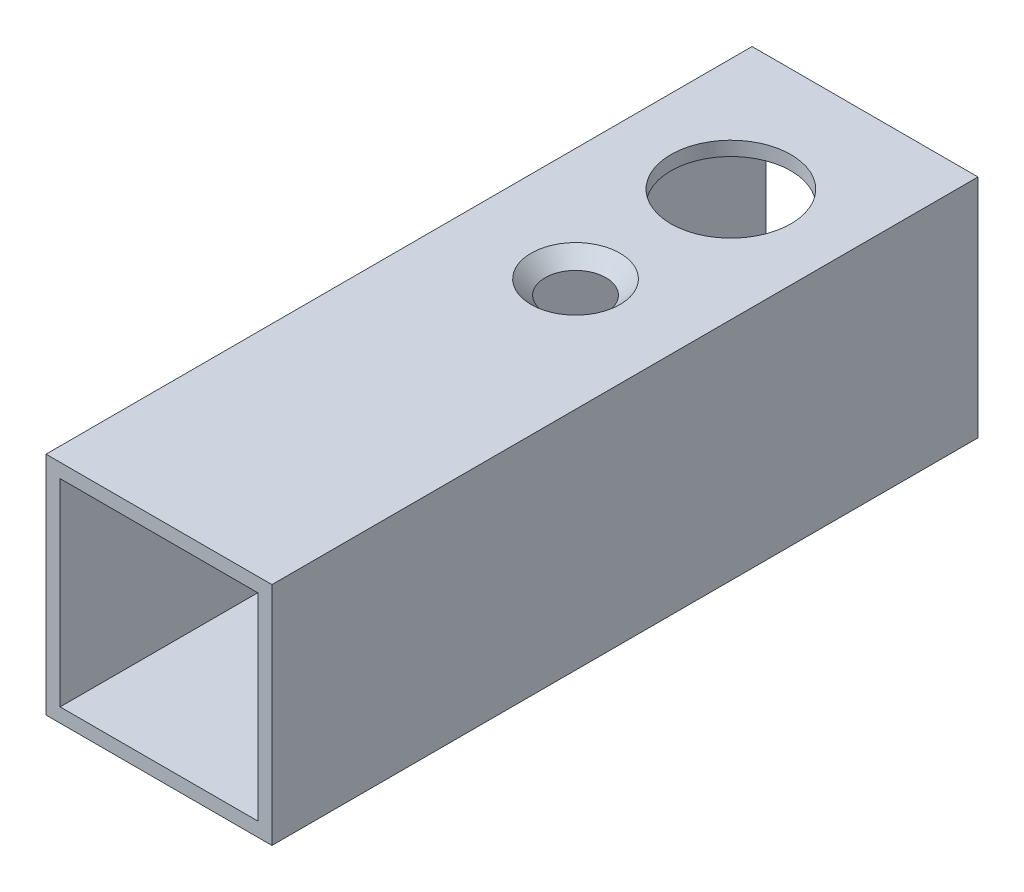
ISO-10303-21;
HEADER;
FILE_DESCRIPTION(('STEP AP214'),'2;1');
FILE_NAME('part.step','',(''),(''),'','','');
FILE_SCHEMA(('AUTOMOTIVE_DESIGN { 1 0 10303 214 1 1 1 1 }'));
ENDSEC;
DATA;
#1=APPLICATION_CONTEXT('core data for automotive mechanical design processes');
#2=APPLICATION_PROTOCOL_DEFINITION('international standard','automotive_design',2000,#1);
#3=PRODUCT_CONTEXT('',#1,'mechanical');
#4=PRODUCT('Part','Part','',(#3));
#5=PRODUCT_RELATED_PRODUCT_CATEGORY('part','',(#4));
#6=PRODUCT_DEFINITION_FORMATION('','',#4);
#7=PRODUCT_DEFINITION_CONTEXT('part definition',#1,'design');
#8=PRODUCT_DEFINITION('design','',#6,#7);
#9=PRODUCT_DEFINITION_SHAPE('','',#8);
#10=(LENGTH_UNIT() NAMED_UNIT(*) SI_UNIT(.MILLI.,.METRE.));
#11=(NAMED_UNIT(*) PLANE_ANGLE_UNIT() SI_UNIT($,.RADIAN.));
#12=(NAMED_UNIT(*) SI_UNIT($,.STERADIAN.) SOLID_ANGLE_UNIT());
#13=UNCERTAINTY_MEASURE_WITH_UNIT(LENGTH_MEASURE(1.E-05),#10,'distance_accuracy_value','');
#14=(GEOMETRIC_REPRESENTATION_CONTEXT(3) GLOBAL_UNCERTAINTY_ASSIGNED_CONTEXT((#13)) GLOBAL_UNIT_ASSIGNED_CONTEXT((#10,
#11,#12)) REPRESENTATION_CONTEXT('',''));
#15=CARTESIAN_POINT('',(0.,0.,0.));
#16=DIRECTION('',(0.,0.,1.));
#17=DIRECTION('',(1.,0.,0.));
#18=AXIS2_PLACEMENT_3D('',#15,#16,#17);
#19=CARTESIAN_POINT('',(0.,0.,50.));
#20=DIRECTION('',(0.,0.,-1.));
#21=DIRECTION('',(-1.,0.,0.));
#22=AXIS2_PLACEMENT_3D('',#19,#20,#21);
#23=PLANE('',#22);
#24=DIRECTION('',(0.,1.,0.));
#25=VECTOR('',#24,1.);
#26=CARTESIAN_POINT('',(8.,-8.,50.));
#27=LINE('',#26,#25);
#28=CARTESIAN_POINT('',(8.,-8.,50.));
#29=VERTEX_POINT('',#28);
#30=CARTESIAN_POINT('',(8.,8.,50.));
#31=VERTEX_POINT('',#30);
#32=EDGE_CURVE('E165',#29,#31,#27,.T.);
#33=ORIENTED_EDGE('',*,*,#32,.T.);
#34=DIRECTION('',(-1.,0.,0.));
#35=VECTOR('',#34,1.);
#36=CARTESIAN_POINT('',(-8.,8.,50.));
#37=LINE('',#36,#35);
#38=CARTESIAN_POINT('',(-8.,8.,50.));
#39=VERTEX_POINT('',#38);
#40=EDGE_CURVE('E169',#31,#39,#37,.T.);
#41=ORIENTED_EDGE('',*,*,#40,.T.);
#42=DIRECTION('',(0.,-1.,0.));
#43=VECTOR('',#42,1.);
#44=CARTESIAN_POINT('',(-8.,-8.,50.));
#45=LINE('',#44,#43);
#46=CARTESIAN_POINT('',(-8.,-8.,50.));
#47=VERTEX_POINT('',#46);
#48=EDGE_CURVE('E172',#39,#47,#45,.T.);
#49=ORIENTED_EDGE('',*,*,#48,.T.);
#50=DIRECTION('',(1.,0.,0.));
#51=VECTOR('',#50,1.);
#52=CARTESIAN_POINT('',(-8.,-8.,50.));
#53=LINE('',#52,#51);
#54=EDGE_CURVE('E175',#47,#29,#53,.T.);
#55=ORIENTED_EDGE('',*,*,#54,.T.);
#56=EDGE_LOOP('',(#33,#41,#49,#55));
#57=FACE_BOUND('',#56,.T.);
#58=DIRECTION('',(0.,1.,0.));
#59=VECTOR('',#58,1.);
#60=CARTESIAN_POINT('',(7.,-7.,50.));
#61=LINE('',#60,#59);
#62=CARTESIAN_POINT('',(7.,-7.,50.));
#63=VERTEX_POINT('',#62);
#64=CARTESIAN_POINT('',(7.,7.,50.));
#65=VERTEX_POINT('',#64);
#66=EDGE_CURVE('E116',#63,#65,#61,.T.);
#67=ORIENTED_EDGE('',*,*,#66,.F.);
#68=DIRECTION('',(1.,0.,0.));
#69=VECTOR('',#68,1.);
#70=CARTESIAN_POINT('',(-7.,-7.,50.));
#71=LINE('',#70,#69);
#72=CARTESIAN_POINT('',(-7.,-7.,50.));
#73=VERTEX_POINT('',#72);
#74=EDGE_CURVE('E144',#73,#63,#71,.T.);
#75=ORIENTED_EDGE('',*,*,#74,.F.);
#76=DIRECTION('',(0.,-1.,0.));
#77=VECTOR('',#76,1.);
#78=CARTESIAN_POINT('',(-7.,-7.,50.));
#79=LINE('',#78,#77);
#80=CARTESIAN_POINT('',(-7.,7.,50.));
#81=VERTEX_POINT('',#80);
#82=EDGE_CURVE('E138',#81,#73,#79,.T.);
#83=ORIENTED_EDGE('',*,*,#82,.F.);
#84=DIRECTION('',(-1.,0.,0.));
#85=VECTOR('',#84,1.);
#86=CARTESIAN_POINT('',(-7.,7.,50.));
#87=LINE('',#86,#85);
#88=EDGE_CURVE('E125',#65,#81,#87,.T.);
#89=ORIENTED_EDGE('',*,*,#88,.F.);
#90=EDGE_LOOP('',(#67,#75,#83,#89));
#91=FACE_BOUND('',#90,.T.);
#92=ADVANCED_FACE('F43',(#57,#91),#23,.F.);
#93=CARTESIAN_POINT('',(0.,0.,0.));
#94=DIRECTION('',(0.,0.,-1.));
#95=DIRECTION('',(-1.,0.,0.));
#96=AXIS2_PLACEMENT_3D('',#93,#94,#95);
#97=PLANE('',#96);
#98=DIRECTION('',(0.,1.,0.));
#99=VECTOR('',#98,1.);
#100=CARTESIAN_POINT('',(8.,-8.,0.));
#101=LINE('',#100,#99);
#102=CARTESIAN_POINT('',(8.,-8.,0.));
#103=VERTEX_POINT('',#102);
#104=CARTESIAN_POINT('',(8.,8.,0.));
#105=VERTEX_POINT('',#104);
#106=EDGE_CURVE('E134',#103,#105,#101,.T.);
#107=ORIENTED_EDGE('',*,*,#106,.F.);
#108=DIRECTION('',(1.,0.,0.));
#109=VECTOR('',#108,1.);
#110=CARTESIAN_POINT('',(-8.,-8.,0.));
#111=LINE('',#110,#109);
#112=CARTESIAN_POINT('',(-8.,-8.,0.));
#113=VERTEX_POINT('',#112);
#114=EDGE_CURVE('E170',#113,#103,#111,.T.);
#115=ORIENTED_EDGE('',*,*,#114,.F.);
#116=DIRECTION('',(0.,-1.,0.));
#117=VECTOR('',#116,1.);
#118=CARTESIAN_POINT('',(-8.,-8.,0.));
#119=LINE('',#118,#117);
#120=CARTESIAN_POINT('',(-8.,8.,0.));
#121=VERTEX_POINT('',#120);
#122=EDGE_CURVE('E184',#121,#113,#119,.T.);
#123=ORIENTED_EDGE('',*,*,#122,.F.);
#124=DIRECTION('',(-1.,0.,0.));
#125=VECTOR('',#124,1.);
#126=CARTESIAN_POINT('',(-8.,8.,0.));
#127=LINE('',#126,#125);
#128=EDGE_CURVE('E182',#105,#121,#127,.T.);
#129=ORIENTED_EDGE('',*,*,#128,.F.);
#130=EDGE_LOOP('',(#107,#115,#123,#129));
#131=FACE_BOUND('',#130,.T.);
#132=DIRECTION('',(1.,0.,0.));
#133=VECTOR('',#132,1.);
#134=CARTESIAN_POINT('',(-7.,-7.,0.));
#135=LINE('',#134,#133);
#136=CARTESIAN_POINT('',(-7.,-7.,0.));
#137=VERTEX_POINT('',#136);
#138=CARTESIAN_POINT('',(7.,-7.,0.));
#139=VERTEX_POINT('',#138);
#140=EDGE_CURVE('E126',#137,#139,#135,.T.);
#141=ORIENTED_EDGE('',*,*,#140,.T.);
#142=DIRECTION('',(0.,1.,0.));
#143=VECTOR('',#142,1.);
#144=CARTESIAN_POINT('',(7.,-7.,0.));
#145=LINE('',#144,#143);
#146=CARTESIAN_POINT('',(7.,7.,0.));
#147=VERTEX_POINT('',#146);
#148=EDGE_CURVE('E72',#139,#147,#145,.T.);
#149=ORIENTED_EDGE('',*,*,#148,.T.);
#150=DIRECTION('',(-1.,0.,0.));
#151=VECTOR('',#150,1.);
#152=CARTESIAN_POINT('',(-7.,7.,0.));
#153=LINE('',#152,#151);
#154=CARTESIAN_POINT('',(-7.,7.,0.));
#155=VERTEX_POINT('',#154);
#156=EDGE_CURVE('E132',#147,#155,#153,.T.);
#157=ORIENTED_EDGE('',*,*,#156,.T.);
#158=DIRECTION('',(0.,-1.,0.));
#159=VECTOR('',#158,1.);
#160=CARTESIAN_POINT('',(-7.,-7.,0.));
#161=LINE('',#160,#159);
#162=EDGE_CURVE('E154',#155,#137,#161,.T.);
#163=ORIENTED_EDGE('',*,*,#162,.T.);
#164=EDGE_LOOP('',(#141,#149,#157,#163));
#165=FACE_BOUND('',#164,.T.);
#166=ADVANCED_FACE('F243',(#131,#165),#97,.T.);
#167=CARTESIAN_POINT('',(8.,-8.,50.));
#168=DIRECTION('',(-1.,0.,0.));
#169=DIRECTION('',(0.,0.,1.));
#170=AXIS2_PLACEMENT_3D('',#167,#168,#169);
#171=PLANE('',#170);
#172=ORIENTED_EDGE('',*,*,#106,.T.);
#173=DIRECTION('',(0.,0.,-1.));
#174=VECTOR('',#173,1.);
#175=CARTESIAN_POINT('',(8.,8.,50.));
#176=LINE('',#175,#174);
#177=EDGE_CURVE('E11',#31,#105,#176,.T.);
#178=ORIENTED_EDGE('',*,*,#177,.F.);
#179=ORIENTED_EDGE('',*,*,#32,.F.);
#180=DIRECTION('',(0.,0.,-1.));
#181=VECTOR('',#180,1.);
#182=CARTESIAN_POINT('',(8.,-8.,50.));
#183=LINE('',#182,#181);
#184=EDGE_CURVE('E178',#29,#103,#183,.T.);
#185=ORIENTED_EDGE('',*,*,#184,.T.);
#186=EDGE_LOOP('',(#172,#178,#179,#185));
#187=FACE_BOUND('',#186,.T.);
#188=ADVANCED_FACE('F45',(#187),#171,.F.);
#189=CARTESIAN_POINT('',(-8.,8.,50.));
#190=DIRECTION('',(0.,-1.,0.));
#191=DIRECTION('',(0.,0.,-1.));
#192=AXIS2_PLACEMENT_3D('',#189,#190,#191);
#193=PLANE('',#192);
#194=CARTESIAN_POINT('',(0.,8.,20.5));
#195=DIRECTION('',(0.,1.,0.));
#196=DIRECTION('',(0.,0.,1.));
#197=AXIS2_PLACEMENT_3D('',#194,#195,#196);
#198=CIRCLE('',#197,3.15);
#199=CARTESIAN_POINT('',(0.,8.,23.65));
#200=VERTEX_POINT('',#199);
#201=EDGE_CURVE('E205',#200,#200,#198,.T.);
#202=ORIENTED_EDGE('',*,*,#201,.F.);
#203=EDGE_LOOP('',(#202));
#204=FACE_BOUND('',#203,.T.);
#205=CARTESIAN_POINT('',(0.,8.,9.5));
#206=DIRECTION('',(0.,1.,0.));
#207=DIRECTION('',(0.,0.,1.));
#208=AXIS2_PLACEMENT_3D('',#205,#206,#207);
#209=CIRCLE('',#208,4.25);
#210=CARTESIAN_POINT('',(0.,8.,13.75));
#211=VERTEX_POINT('',#210);
#212=EDGE_CURVE('E204',#211,#211,#209,.T.);
#213=ORIENTED_EDGE('',*,*,#212,.F.);
#214=EDGE_LOOP('',(#213));
#215=FACE_BOUND('',#214,.T.);
#216=ORIENTED_EDGE('',*,*,#128,.T.);
#217=DIRECTION('',(0.,0.,-1.));
#218=VECTOR('',#217,1.);
#219=CARTESIAN_POINT('',(-8.,8.,50.));
#220=LINE('',#219,#218);
#221=EDGE_CURVE('E53',#39,#121,#220,.T.);
#222=ORIENTED_EDGE('',*,*,#221,.F.);
#223=ORIENTED_EDGE('',*,*,#40,.F.);
#224=ORIENTED_EDGE('',*,*,#177,.T.);
#225=EDGE_LOOP('',(#216,#222,#223,#224));
#226=FACE_BOUND('',#225,.T.);
#227=ADVANCED_FACE('F256',(#204,#215,#226),#193,.F.);
#228=CARTESIAN_POINT('',(-8.,-8.,50.));
#229=DIRECTION('',(1.,0.,0.));
#230=DIRECTION('',(0.,0.,-1.));
#231=AXIS2_PLACEMENT_3D('',#228,#229,#230);
#232=PLANE('',#231);
#233=ORIENTED_EDGE('',*,*,#122,.T.);
#234=DIRECTION('',(0.,0.,-1.));
#235=VECTOR('',#234,1.);
#236=CARTESIAN_POINT('',(-8.,-8.,50.));
#237=LINE('',#236,#235);
#238=EDGE_CURVE('E191',#47,#113,#237,.T.);
#239=ORIENTED_EDGE('',*,*,#238,.F.);
#240=ORIENTED_EDGE('',*,*,#48,.F.);
#241=ORIENTED_EDGE('',*,*,#221,.T.);
#242=EDGE_LOOP('',(#233,#239,#240,#241));
#243=FACE_BOUND('',#242,.T.);
#244=ADVANCED_FACE('F253',(#243),#232,.F.);
#245=CARTESIAN_POINT('',(-8.,-8.,50.));
#246=DIRECTION('',(0.,1.,0.));
#247=DIRECTION('',(0.,0.,1.));
#248=AXIS2_PLACEMENT_3D('',#245,#246,#247);
#249=PLANE('',#248);
#250=CARTESIAN_POINT('',(0.,-8.,20.5));
#251=DIRECTION('',(0.,-1.,0.));
#252=DIRECTION('',(0.,0.,-1.));
#253=AXIS2_PLACEMENT_3D('',#250,#251,#252);
#254=CIRCLE('',#253,3.15);
#255=CARTESIAN_POINT('',(0.,-8.,17.35));
#256=VERTEX_POINT('',#255);
#257=EDGE_CURVE('E217',#256,#256,#254,.T.);
#258=ORIENTED_EDGE('',*,*,#257,.F.);
#259=EDGE_LOOP('',(#258));
#260=FACE_BOUND('',#259,.T.);
#261=CARTESIAN_POINT('',(0.,-8.,9.5));
#262=DIRECTION('',(0.,1.,0.));
#263=DIRECTION('',(0.,0.,1.));
#264=AXIS2_PLACEMENT_3D('',#261,#262,#263);
#265=CIRCLE('',#264,4.25);
#266=CARTESIAN_POINT('',(0.,-8.,13.75));
#267=VERTEX_POINT('',#266);
#268=EDGE_CURVE('E200',#267,#267,#265,.T.);
#269=ORIENTED_EDGE('',*,*,#268,.T.);
#270=EDGE_LOOP('',(#269));
#271=FACE_BOUND('',#270,.T.);
#272=ORIENTED_EDGE('',*,*,#114,.T.);
#273=ORIENTED_EDGE('',*,*,#184,.F.);
#274=ORIENTED_EDGE('',*,*,#54,.F.);
#275=ORIENTED_EDGE('',*,*,#238,.T.);
#276=EDGE_LOOP('',(#272,#273,#274,#275));
#277=FACE_BOUND('',#276,.T.);
#278=ADVANCED_FACE('F241',(#260,#271,#277),#249,.F.);
#279=CARTESIAN_POINT('',(7.,-7.,50.));
#280=DIRECTION('',(-1.,0.,0.));
#281=DIRECTION('',(0.,0.,1.));
#282=AXIS2_PLACEMENT_3D('',#279,#280,#281);
#283=PLANE('',#282);
#284=ORIENTED_EDGE('',*,*,#148,.F.);
#285=DIRECTION('',(0.,0.,-1.));
#286=VECTOR('',#285,1.);
#287=CARTESIAN_POINT('',(7.,-7.,50.));
#288=LINE('',#287,#286);
#289=EDGE_CURVE('E120',#63,#139,#288,.T.);
#290=ORIENTED_EDGE('',*,*,#289,.F.);
#291=ORIENTED_EDGE('',*,*,#66,.T.);
#292=DIRECTION('',(0.,0.,-1.));
#293=VECTOR('',#292,1.);
#294=CARTESIAN_POINT('',(7.,7.,50.));
#295=LINE('',#294,#293);
#296=EDGE_CURVE('E119',#65,#147,#295,.T.);
#297=ORIENTED_EDGE('',*,*,#296,.T.);
#298=EDGE_LOOP('',(#284,#290,#291,#297));
#299=FACE_BOUND('',#298,.T.);
#300=ADVANCED_FACE('F118',(#299),#283,.T.);
#301=CARTESIAN_POINT('',(-7.,7.,50.));
#302=DIRECTION('',(0.,-1.,0.));
#303=DIRECTION('',(0.,0.,-1.));
#304=AXIS2_PLACEMENT_3D('',#301,#302,#303);
#305=PLANE('',#304);
#306=CARTESIAN_POINT('',(0.,7.,20.5));
#307=DIRECTION('',(0.,-1.,0.));
#308=DIRECTION('',(0.,0.,-1.));
#309=AXIS2_PLACEMENT_3D('',#306,#307,#308);
#310=CIRCLE('',#309,2.15);
#311=CARTESIAN_POINT('',(0.,7.,18.35));
#312=VERTEX_POINT('',#311);
#313=EDGE_CURVE('E201',#312,#312,#310,.T.);
#314=ORIENTED_EDGE('',*,*,#313,.F.);
#315=EDGE_LOOP('',(#314));
#316=FACE_BOUND('',#315,.T.);
#317=CARTESIAN_POINT('',(0.,7.,9.5));
#318=DIRECTION('',(0.,-1.,0.));
#319=DIRECTION('',(0.,0.,-1.));
#320=AXIS2_PLACEMENT_3D('',#317,#318,#319);
#321=CIRCLE('',#320,4.25);
#322=CARTESIAN_POINT('',(0.,7.,5.25));
#323=VERTEX_POINT('',#322);
#324=EDGE_CURVE('E152',#323,#323,#321,.T.);
#325=ORIENTED_EDGE('',*,*,#324,.F.);
#326=EDGE_LOOP('',(#325));
#327=FACE_BOUND('',#326,.T.);
#328=ORIENTED_EDGE('',*,*,#156,.F.);
#329=ORIENTED_EDGE('',*,*,#296,.F.);
#330=ORIENTED_EDGE('',*,*,#88,.T.);
#331=DIRECTION('',(0.,0.,-1.));
#332=VECTOR('',#331,1.);
#333=CARTESIAN_POINT('',(-7.,7.,50.));
#334=LINE('',#333,#332);
#335=EDGE_CURVE('E135',#81,#155,#334,.T.);
#336=ORIENTED_EDGE('',*,*,#335,.T.);
#337=EDGE_LOOP('',(#328,#329,#330,#336));
#338=FACE_BOUND('',#337,.T.);
#339=ADVANCED_FACE('F129',(#316,#327,#338),#305,.T.);
#340=CARTESIAN_POINT('',(-7.,-7.,50.));
#341=DIRECTION('',(1.,0.,0.));
#342=DIRECTION('',(0.,0.,-1.));
#343=AXIS2_PLACEMENT_3D('',#340,#341,#342);
#344=PLANE('',#343);
#345=ORIENTED_EDGE('',*,*,#162,.F.);
#346=ORIENTED_EDGE('',*,*,#335,.F.);
#347=ORIENTED_EDGE('',*,*,#82,.T.);
#348=DIRECTION('',(0.,0.,-1.));
#349=VECTOR('',#348,1.);
#350=CARTESIAN_POINT('',(-7.,-7.,50.));
#351=LINE('',#350,#349);
#352=EDGE_CURVE('E61',#73,#137,#351,.T.);
#353=ORIENTED_EDGE('',*,*,#352,.T.);
#354=EDGE_LOOP('',(#345,#346,#347,#353));
#355=FACE_BOUND('',#354,.T.);
#356=ADVANCED_FACE('F230',(#355),#344,.T.);
#357=CARTESIAN_POINT('',(-7.,-7.,50.));
#358=DIRECTION('',(0.,1.,0.));
#359=DIRECTION('',(0.,0.,1.));
#360=AXIS2_PLACEMENT_3D('',#357,#358,#359);
#361=PLANE('',#360);
#362=CARTESIAN_POINT('',(0.,-7.,20.5));
#363=DIRECTION('',(0.,1.,0.));
#364=DIRECTION('',(0.,0.,1.));
#365=AXIS2_PLACEMENT_3D('',#362,#363,#364);
#366=CIRCLE('',#365,2.15);
#367=CARTESIAN_POINT('',(0.,-7.,22.65));
#368=VERTEX_POINT('',#367);
#369=EDGE_CURVE('E47',#368,#368,#366,.T.);
#370=ORIENTED_EDGE('',*,*,#369,.F.);
#371=EDGE_LOOP('',(#370));
#372=FACE_BOUND('',#371,.T.);
#373=CARTESIAN_POINT('',(0.,-7.,9.5));
#374=DIRECTION('',(0.,1.,0.));
#375=DIRECTION('',(0.,0.,1.));
#376=AXIS2_PLACEMENT_3D('',#373,#374,#375);
#377=CIRCLE('',#376,4.25);
#378=CARTESIAN_POINT('',(0.,-7.,13.75));
#379=VERTEX_POINT('',#378);
#380=EDGE_CURVE('E197',#379,#379,#377,.T.);
#381=ORIENTED_EDGE('',*,*,#380,.F.);
#382=EDGE_LOOP('',(#381));
#383=FACE_BOUND('',#382,.T.);
#384=ORIENTED_EDGE('',*,*,#140,.F.);
#385=ORIENTED_EDGE('',*,*,#352,.F.);
#386=ORIENTED_EDGE('',*,*,#74,.T.);
#387=ORIENTED_EDGE('',*,*,#289,.T.);
#388=EDGE_LOOP('',(#384,#385,#386,#387));
#389=FACE_BOUND('',#388,.T.);
#390=ADVANCED_FACE('F237',(#372,#383,#389),#361,.T.);
#391=CARTESIAN_POINT('',(0.,-8.,9.5));
#392=DIRECTION('',(0.,1.,0.));
#393=DIRECTION('',(0.,0.,1.));
#394=AXIS2_PLACEMENT_3D('',#391,#392,#393);
#395=CYLINDRICAL_SURFACE('',#394,4.25);
#396=ORIENTED_EDGE('',*,*,#380,.T.);
#397=EDGE_LOOP('',(#396));
#398=FACE_BOUND('',#397,.T.);
#399=ORIENTED_EDGE('',*,*,#268,.F.);
#400=EDGE_LOOP('',(#399));
#401=FACE_BOUND('',#400,.T.);
#402=ADVANCED_FACE('F279',(#398,#401),#395,.F.);
#403=ORIENTED_EDGE('',*,*,#324,.T.);
#404=EDGE_LOOP('',(#403));
#405=FACE_BOUND('',#404,.T.);
#406=ORIENTED_EDGE('',*,*,#212,.T.);
#407=EDGE_LOOP('',(#406));
#408=FACE_BOUND('',#407,.T.);
#409=ADVANCED_FACE('F226',(#405,#408),#395,.F.);
#410=CARTESIAN_POINT('',(0.,8.,20.5));
#411=DIRECTION('',(0.,1.,0.));
#412=DIRECTION('',(0.,0.,1.));
#413=AXIS2_PLACEMENT_3D('',#410,#411,#412);
#414=CONICAL_SURFACE('',#413,3.15,0.785398163397448);
#415=ORIENTED_EDGE('',*,*,#313,.T.);
#416=EDGE_LOOP('',(#415));
#417=FACE_BOUND('',#416,.T.);
#418=ORIENTED_EDGE('',*,*,#201,.T.);
#419=EDGE_LOOP('',(#418));
#420=FACE_BOUND('',#419,.T.);
#421=ADVANCED_FACE('F290',(#417,#420),#414,.F.);
#422=CARTESIAN_POINT('',(0.,-8.,20.5));
#423=DIRECTION('',(0.,-1.,0.));
#424=DIRECTION('',(0.,0.,-1.));
#425=AXIS2_PLACEMENT_3D('',#422,#423,#424);
#426=CONICAL_SURFACE('',#425,3.15,0.785398163397448);
#427=ORIENTED_EDGE('',*,*,#369,.T.);
#428=EDGE_LOOP('',(#427));
#429=FACE_BOUND('',#428,.T.);
#430=ORIENTED_EDGE('',*,*,#257,.T.);
#431=EDGE_LOOP('',(#430));
#432=FACE_BOUND('',#431,.T.);
#433=ADVANCED_FACE('F293',(#429,#432),#426,.F.);
#434=CLOSED_SHELL('',(#92,#166,#188,#227,#244,#278,#300,#339,#356,#390,#402,#409,#421,#433));
#435=MANIFOLD_SOLID_BREP('B2',#434);
#436=ADVANCED_BREP_SHAPE_REPRESENTATION('',(#18,#435),#14);
#437=SHAPE_DEFINITION_REPRESENTATION(#9,#436);
ENDSEC;
END-ISO-10303-21;
